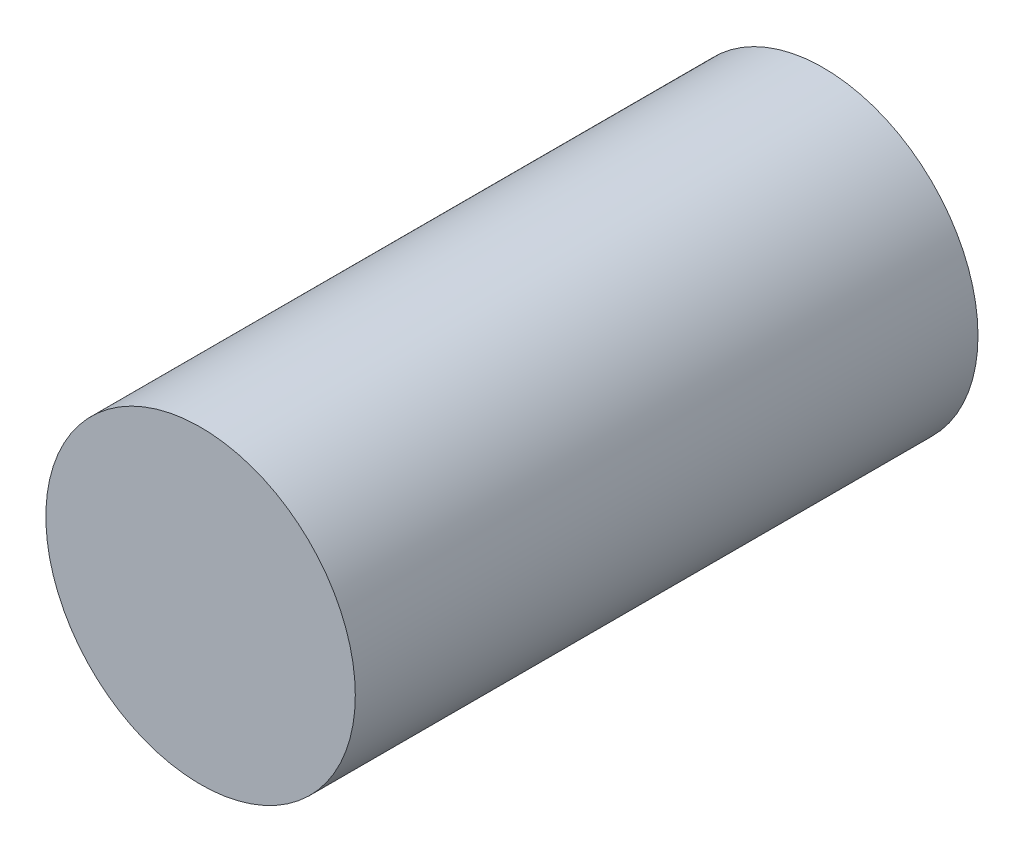
ISO-10303-21;
HEADER;
FILE_DESCRIPTION(('STEP AP214'),'2;1');
FILE_NAME('part.step','',(''),(''),'','','');
FILE_SCHEMA(('AUTOMOTIVE_DESIGN { 1 0 10303 214 1 1 1 1 }'));
ENDSEC;
DATA;
#1=APPLICATION_CONTEXT('core data for automotive mechanical design processes');
#2=APPLICATION_PROTOCOL_DEFINITION('international standard','automotive_design',2000,#1);
#3=PRODUCT_CONTEXT('',#1,'mechanical');
#4=PRODUCT('Part','Part','',(#3));
#5=PRODUCT_RELATED_PRODUCT_CATEGORY('part','',(#4));
#6=PRODUCT_DEFINITION_FORMATION('','',#4);
#7=PRODUCT_DEFINITION_CONTEXT('part definition',#1,'design');
#8=PRODUCT_DEFINITION('design','',#6,#7);
#9=PRODUCT_DEFINITION_SHAPE('','',#8);
#10=(LENGTH_UNIT() NAMED_UNIT(*) SI_UNIT(.MILLI.,.METRE.));
#11=(NAMED_UNIT(*) PLANE_ANGLE_UNIT() SI_UNIT($,.RADIAN.));
#12=(NAMED_UNIT(*) SI_UNIT($,.STERADIAN.) SOLID_ANGLE_UNIT());
#13=UNCERTAINTY_MEASURE_WITH_UNIT(LENGTH_MEASURE(1.E-05),#10,'distance_accuracy_value','');
#14=(GEOMETRIC_REPRESENTATION_CONTEXT(3) GLOBAL_UNCERTAINTY_ASSIGNED_CONTEXT((#13)) GLOBAL_UNIT_ASSIGNED_CONTEXT((#10,
#11,#12)) REPRESENTATION_CONTEXT('',''));
#15=CARTESIAN_POINT('',(0.,0.,0.));
#16=DIRECTION('',(0.,0.,1.));
#17=DIRECTION('',(1.,0.,0.));
#18=AXIS2_PLACEMENT_3D('',#15,#16,#17);
#19=CARTESIAN_POINT('',(0.,0.,33.));
#20=DIRECTION('',(0.,0.,-1.));
#21=DIRECTION('',(-1.,0.,0.));
#22=AXIS2_PLACEMENT_3D('',#19,#20,#21);
#23=CYLINDRICAL_SURFACE('',#22,8.2);
#24=CARTESIAN_POINT('',(0.,0.,33.));
#25=DIRECTION('',(0.,0.,1.));
#26=DIRECTION('',(1.,0.,0.));
#27=AXIS2_PLACEMENT_3D('',#24,#25,#26);
#28=CIRCLE('',#27,8.2);
#29=CARTESIAN_POINT('',(8.2,0.,33.));
#30=VERTEX_POINT('',#29);
#31=EDGE_CURVE('E10',#30,#30,#28,.T.);
#32=ORIENTED_EDGE('',*,*,#31,.F.);
#33=EDGE_LOOP('',(#32));
#34=FACE_BOUND('',#33,.T.);
#35=CARTESIAN_POINT('',(0.,0.,0.));
#36=DIRECTION('',(0.,0.,1.));
#37=DIRECTION('',(1.,0.,0.));
#38=AXIS2_PLACEMENT_3D('',#35,#36,#37);
#39=CIRCLE('',#38,8.2);
#40=CARTESIAN_POINT('',(8.2,0.,0.));
#41=VERTEX_POINT('',#40);
#42=EDGE_CURVE('E36',#41,#41,#39,.T.);
#43=ORIENTED_EDGE('',*,*,#42,.T.);
#44=EDGE_LOOP('',(#43));
#45=FACE_BOUND('',#44,.T.);
#46=ADVANCED_FACE('F29',(#34,#45),#23,.T.);
#47=CARTESIAN_POINT('',(0.,0.,33.));
#48=DIRECTION('',(0.,0.,1.));
#49=DIRECTION('',(1.,0.,0.));
#50=AXIS2_PLACEMENT_3D('',#47,#48,#49);
#51=PLANE('',#50);
#52=ORIENTED_EDGE('',*,*,#31,.T.);
#53=EDGE_LOOP('',(#52));
#54=FACE_BOUND('',#53,.T.);
#55=ADVANCED_FACE('F62',(#54),#51,.T.);
#56=CARTESIAN_POINT('',(0.,0.,0.));
#57=DIRECTION('',(0.,0.,1.));
#58=DIRECTION('',(1.,0.,0.));
#59=AXIS2_PLACEMENT_3D('',#56,#57,#58);
#60=PLANE('',#59);
#61=CARTESIAN_POINT('',(0.,0.,0.));
#62=DIRECTION('',(0.,0.,1.));
#63=DIRECTION('',(1.,0.,0.));
#64=AXIS2_PLACEMENT_3D('',#61,#62,#63);
#65=CIRCLE('',#64,3.);
#66=CARTESIAN_POINT('',(3.,0.,0.));
#67=VERTEX_POINT('',#66);
#68=EDGE_CURVE('E32',#67,#67,#65,.T.);
#69=ORIENTED_EDGE('',*,*,#68,.T.);
#70=EDGE_LOOP('',(#69));
#71=FACE_BOUND('',#70,.T.);
#72=ORIENTED_EDGE('',*,*,#42,.F.);
#73=EDGE_LOOP('',(#72));
#74=FACE_BOUND('',#73,.T.);
#75=ADVANCED_FACE('F49',(#71,#74),#60,.F.);
#76=CARTESIAN_POINT('',(0.,0.,-1.));
#77=DIRECTION('',(0.,0.,1.));
#78=DIRECTION('',(1.,0.,0.));
#79=AXIS2_PLACEMENT_3D('',#76,#77,#78);
#80=CYLINDRICAL_SURFACE('',#79,3.);
#81=CARTESIAN_POINT('',(0.,0.,-1.));
#82=DIRECTION('',(0.,0.,1.));
#83=DIRECTION('',(1.,0.,0.));
#84=AXIS2_PLACEMENT_3D('',#81,#82,#83);
#85=CIRCLE('',#84,3.);
#86=CARTESIAN_POINT('',(3.,0.,-1.));
#87=VERTEX_POINT('',#86);
#88=EDGE_CURVE('E42',#87,#87,#85,.T.);
#89=ORIENTED_EDGE('',*,*,#88,.T.);
#90=EDGE_LOOP('',(#89));
#91=FACE_BOUND('',#90,.T.);
#92=ORIENTED_EDGE('',*,*,#68,.F.);
#93=EDGE_LOOP('',(#92));
#94=FACE_BOUND('',#93,.T.);
#95=ADVANCED_FACE('F52',(#91,#94),#80,.T.);
#96=CARTESIAN_POINT('',(0.,0.,-1.));
#97=DIRECTION('',(0.,0.,1.));
#98=DIRECTION('',(1.,0.,0.));
#99=AXIS2_PLACEMENT_3D('',#96,#97,#98);
#100=PLANE('',#99);
#101=ORIENTED_EDGE('',*,*,#88,.F.);
#102=EDGE_LOOP('',(#101));
#103=FACE_BOUND('',#102,.T.);
#104=ADVANCED_FACE('F54',(#103),#100,.F.);
#105=CLOSED_SHELL('',(#46,#55,#75,#95,#104));
#106=MANIFOLD_SOLID_BREP('B2',#105);
#107=ADVANCED_BREP_SHAPE_REPRESENTATION('',(#18,#106),#14);
#108=SHAPE_DEFINITION_REPRESENTATION(#9,#107);
ENDSEC;
END-ISO-10303-21;
